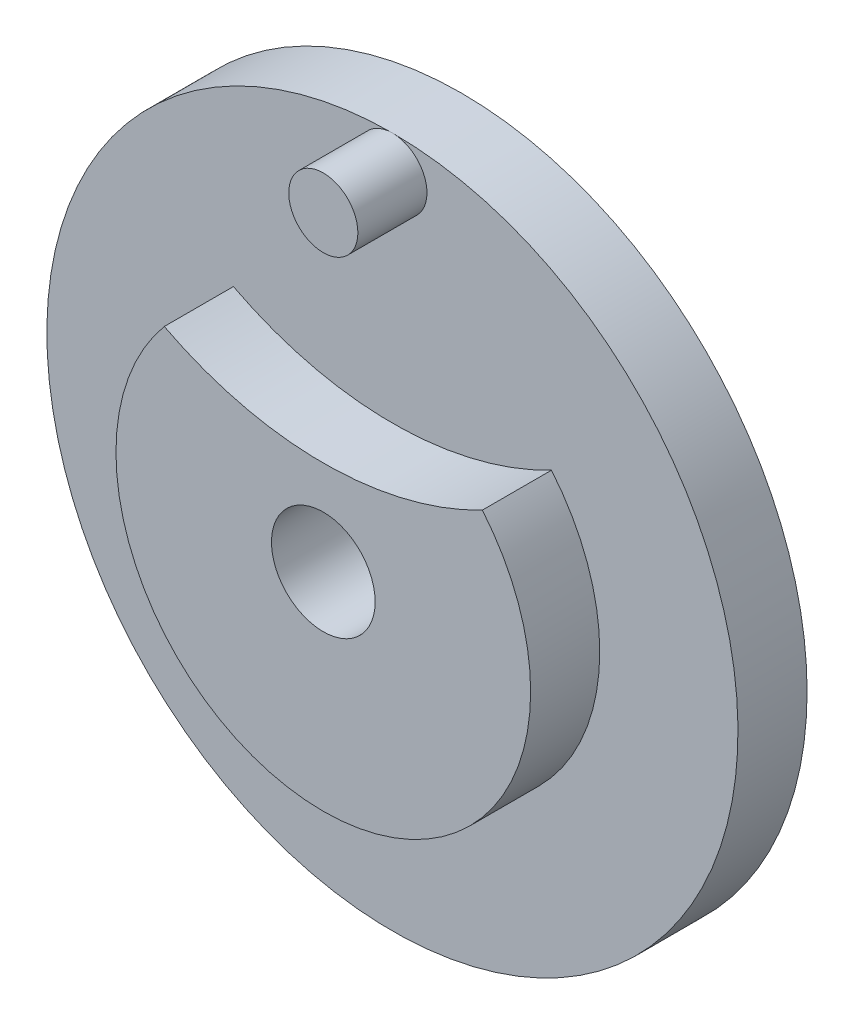
ISO-10303-21;
HEADER;
FILE_DESCRIPTION(('STEP AP214'),'2;1');
FILE_NAME('part.step','',(''),(''),'','','');
FILE_SCHEMA(('AUTOMOTIVE_DESIGN { 1 0 10303 214 1 1 1 1 }'));
ENDSEC;
DATA;
#1=APPLICATION_CONTEXT('core data for automotive mechanical design processes');
#2=APPLICATION_PROTOCOL_DEFINITION('international standard','automotive_design',2000,#1);
#3=PRODUCT_CONTEXT('',#1,'mechanical');
#4=PRODUCT('Part','Part','',(#3));
#5=PRODUCT_RELATED_PRODUCT_CATEGORY('part','',(#4));
#6=PRODUCT_DEFINITION_FORMATION('','',#4);
#7=PRODUCT_DEFINITION_CONTEXT('part definition',#1,'design');
#8=PRODUCT_DEFINITION('design','',#6,#7);
#9=PRODUCT_DEFINITION_SHAPE('','',#8);
#10=(LENGTH_UNIT() NAMED_UNIT(*) SI_UNIT(.MILLI.,.METRE.));
#11=(NAMED_UNIT(*) PLANE_ANGLE_UNIT() SI_UNIT($,.RADIAN.));
#12=(NAMED_UNIT(*) SI_UNIT($,.STERADIAN.) SOLID_ANGLE_UNIT());
#13=UNCERTAINTY_MEASURE_WITH_UNIT(LENGTH_MEASURE(1.E-05),#10,'distance_accuracy_value','');
#14=(GEOMETRIC_REPRESENTATION_CONTEXT(3) GLOBAL_UNCERTAINTY_ASSIGNED_CONTEXT((#13)) GLOBAL_UNIT_ASSIGNED_CONTEXT((#10,
#11,#12)) REPRESENTATION_CONTEXT('',''));
#15=CARTESIAN_POINT('',(0.,0.,0.));
#16=DIRECTION('',(0.,0.,1.));
#17=DIRECTION('',(1.,0.,0.));
#18=AXIS2_PLACEMENT_3D('',#15,#16,#17);
#19=CARTESIAN_POINT('',(0.,0.,2.5));
#20=DIRECTION('',(0.,0.,-1.));
#21=DIRECTION('',(-1.,0.,0.));
#22=AXIS2_PLACEMENT_3D('',#19,#20,#21);
#23=CYLINDRICAL_SURFACE('',#22,25.);
#24=CARTESIAN_POINT('',(0.,0.,2.5));
#25=DIRECTION('',(0.,0.,1.));
#26=DIRECTION('',(1.,0.,0.));
#27=AXIS2_PLACEMENT_3D('',#24,#25,#26);
#28=CIRCLE('',#27,25.);
#29=CARTESIAN_POINT('',(0.,25.,2.5));
#30=VERTEX_POINT('',#29);
#31=EDGE_CURVE('E82',#30,#30,#28,.T.);
#32=ORIENTED_EDGE('',*,*,#31,.F.);
#33=EDGE_LOOP('',(#32));
#34=FACE_BOUND('',#33,.T.);
#35=CARTESIAN_POINT('',(0.,0.,-2.5));
#36=DIRECTION('',(0.,0.,1.));
#37=DIRECTION('',(1.,0.,0.));
#38=AXIS2_PLACEMENT_3D('',#35,#36,#37);
#39=CIRCLE('',#38,25.);
#40=CARTESIAN_POINT('',(25.,0.,-2.5));
#41=VERTEX_POINT('',#40);
#42=EDGE_CURVE('E85',#41,#41,#39,.T.);
#43=ORIENTED_EDGE('',*,*,#42,.T.);
#44=EDGE_LOOP('',(#43));
#45=FACE_BOUND('',#44,.T.);
#46=ADVANCED_FACE('F33',(#34,#45),#23,.T.);
#47=CARTESIAN_POINT('',(0.,0.,2.5));
#48=DIRECTION('',(0.,0.,1.));
#49=DIRECTION('',(1.,0.,0.));
#50=AXIS2_PLACEMENT_3D('',#47,#48,#49);
#51=PLANE('',#50);
#52=CARTESIAN_POINT('',(0.,0.,2.5));
#53=DIRECTION('',(0.,0.,1.));
#54=DIRECTION('',(1.,0.,0.));
#55=AXIS2_PLACEMENT_3D('',#52,#53,#54);
#56=CIRCLE('',#55,15.);
#57=CARTESIAN_POINT('',(11.505168712167,9.6245048134735,2.5));
#58=VERTEX_POINT('',#57);
#59=CARTESIAN_POINT('',(-11.505168712167,9.6245048134735,2.5));
#60=VERTEX_POINT('',#59);
#61=EDGE_CURVE('E40',#58,#60,#56,.F.);
#62=ORIENTED_EDGE('',*,*,#61,.T.);
#63=CARTESIAN_POINT('',(0.,31.8197992,2.5));
#64=DIRECTION('',(0.,0.,1.));
#65=DIRECTION('',(1.,0.,0.));
#66=AXIS2_PLACEMENT_3D('',#63,#64,#65);
#67=CIRCLE('',#66,25.);
#68=EDGE_CURVE('E11',#60,#58,#67,.T.);
#69=ORIENTED_EDGE('',*,*,#68,.T.);
#70=EDGE_LOOP('',(#62,#69));
#71=FACE_BOUND('',#70,.T.);
#72=ORIENTED_EDGE('',*,*,#31,.T.);
#73=CARTESIAN_POINT('',(0.,22.5,2.5));
#74=DIRECTION('',(0.,0.,1.));
#75=DIRECTION('',(1.,0.,0.));
#76=AXIS2_PLACEMENT_3D('',#73,#74,#75);
#77=CIRCLE('',#76,2.5);
#78=EDGE_CURVE('E53',#30,#30,#77,.F.);
#79=ORIENTED_EDGE('',*,*,#78,.T.);
#80=EDGE_LOOP('',(#72,#79));
#81=FACE_BOUND('',#80,.T.);
#82=ADVANCED_FACE('F89',(#71,#81),#51,.T.);
#83=CARTESIAN_POINT('',(0.,0.,-2.5));
#84=DIRECTION('',(0.,0.,1.));
#85=DIRECTION('',(1.,0.,0.));
#86=AXIS2_PLACEMENT_3D('',#83,#84,#85);
#87=PLANE('',#86);
#88=CARTESIAN_POINT('',(0.,0.,-2.5));
#89=DIRECTION('',(0.,0.,1.));
#90=DIRECTION('',(1.,0.,0.));
#91=AXIS2_PLACEMENT_3D('',#88,#89,#90);
#92=CIRCLE('',#91,3.75);
#93=CARTESIAN_POINT('',(3.75,0.,-2.5));
#94=VERTEX_POINT('',#93);
#95=EDGE_CURVE('E72',#94,#94,#92,.T.);
#96=ORIENTED_EDGE('',*,*,#95,.T.);
#97=EDGE_LOOP('',(#96));
#98=FACE_BOUND('',#97,.T.);
#99=ORIENTED_EDGE('',*,*,#42,.F.);
#100=EDGE_LOOP('',(#99));
#101=FACE_BOUND('',#100,.T.);
#102=ADVANCED_FACE('F92',(#98,#101),#87,.F.);
#103=CARTESIAN_POINT('',(0.,22.5,7.5));
#104=DIRECTION('',(0.,0.,-1.));
#105=DIRECTION('',(-1.,0.,0.));
#106=AXIS2_PLACEMENT_3D('',#103,#104,#105);
#107=CYLINDRICAL_SURFACE('',#106,2.5);
#108=ORIENTED_EDGE('',*,*,#78,.F.);
#109=EDGE_LOOP('',(#108));
#110=FACE_BOUND('',#109,.T.);
#111=CARTESIAN_POINT('',(0.,22.5,7.5));
#112=DIRECTION('',(0.,0.,1.));
#113=DIRECTION('',(1.,0.,0.));
#114=AXIS2_PLACEMENT_3D('',#111,#112,#113);
#115=CIRCLE('',#114,2.5);
#116=CARTESIAN_POINT('',(2.5,22.5,7.5));
#117=VERTEX_POINT('',#116);
#118=EDGE_CURVE('E76',#117,#117,#115,.T.);
#119=ORIENTED_EDGE('',*,*,#118,.F.);
#120=EDGE_LOOP('',(#119));
#121=FACE_BOUND('',#120,.T.);
#122=ADVANCED_FACE('F101',(#110,#121),#107,.T.);
#123=CARTESIAN_POINT('',(0.,22.5,7.5));
#124=DIRECTION('',(0.,0.,1.));
#125=DIRECTION('',(1.,0.,0.));
#126=AXIS2_PLACEMENT_3D('',#123,#124,#125);
#127=PLANE('',#126);
#128=ORIENTED_EDGE('',*,*,#118,.T.);
#129=EDGE_LOOP('',(#128));
#130=FACE_BOUND('',#129,.T.);
#131=ADVANCED_FACE('F106',(#130),#127,.T.);
#132=CARTESIAN_POINT('',(0.,31.8197992,7.5));
#133=DIRECTION('',(0.,0.,-1.));
#134=DIRECTION('',(-1.,0.,0.));
#135=AXIS2_PLACEMENT_3D('',#132,#133,#134);
#136=CYLINDRICAL_SURFACE('',#135,25.);
#137=ORIENTED_EDGE('',*,*,#68,.F.);
#138=DIRECTION('',(0.,0.,-1.));
#139=VECTOR('',#138,1.);
#140=CARTESIAN_POINT('',(-11.505168712167,9.6245048134735,7.5));
#141=LINE('',#140,#139);
#142=CARTESIAN_POINT('',(-11.505168712167,9.6245048134735,7.5));
#143=VERTEX_POINT('',#142);
#144=EDGE_CURVE('E47',#143,#60,#141,.T.);
#145=ORIENTED_EDGE('',*,*,#144,.F.);
#146=CARTESIAN_POINT('',(0.,31.8197992,7.5));
#147=DIRECTION('',(0.,0.,-1.));
#148=DIRECTION('',(1.,0.,0.));
#149=AXIS2_PLACEMENT_3D('',#146,#147,#148);
#150=CIRCLE('',#149,25.);
#151=CARTESIAN_POINT('',(11.505168712167,9.6245048134735,7.5));
#152=VERTEX_POINT('',#151);
#153=EDGE_CURVE('E68',#152,#143,#150,.T.);
#154=ORIENTED_EDGE('',*,*,#153,.F.);
#155=DIRECTION('',(0.,0.,-1.));
#156=VECTOR('',#155,1.);
#157=CARTESIAN_POINT('',(11.505168712167,9.6245048134735,7.5));
#158=LINE('',#157,#156);
#159=EDGE_CURVE('E65',#152,#58,#158,.T.);
#160=ORIENTED_EDGE('',*,*,#159,.T.);
#161=EDGE_LOOP('',(#137,#145,#154,#160));
#162=FACE_BOUND('',#161,.T.);
#163=ADVANCED_FACE('F74',(#162),#136,.F.);
#164=CARTESIAN_POINT('',(0.,0.,7.5));
#165=DIRECTION('',(0.,0.,-1.));
#166=DIRECTION('',(-1.,0.,0.));
#167=AXIS2_PLACEMENT_3D('',#164,#165,#166);
#168=CYLINDRICAL_SURFACE('',#167,15.);
#169=ORIENTED_EDGE('',*,*,#61,.F.);
#170=ORIENTED_EDGE('',*,*,#159,.F.);
#171=CARTESIAN_POINT('',(0.,0.,7.5));
#172=DIRECTION('',(0.,0.,1.));
#173=DIRECTION('',(1.,0.,0.));
#174=AXIS2_PLACEMENT_3D('',#171,#172,#173);
#175=CIRCLE('',#174,15.);
#176=EDGE_CURVE('E61',#143,#152,#175,.T.);
#177=ORIENTED_EDGE('',*,*,#176,.F.);
#178=ORIENTED_EDGE('',*,*,#144,.T.);
#179=EDGE_LOOP('',(#169,#170,#177,#178));
#180=FACE_BOUND('',#179,.T.);
#181=ADVANCED_FACE('F63',(#180),#168,.T.);
#182=CARTESIAN_POINT('',(0.,15.9098996,7.5));
#183=DIRECTION('',(0.,0.,1.));
#184=DIRECTION('',(1.,0.,0.));
#185=AXIS2_PLACEMENT_3D('',#182,#183,#184);
#186=PLANE('',#185);
#187=CARTESIAN_POINT('',(0.,0.,7.5));
#188=DIRECTION('',(0.,0.,1.));
#189=DIRECTION('',(1.,0.,0.));
#190=AXIS2_PLACEMENT_3D('',#187,#188,#189);
#191=CIRCLE('',#190,3.75);
#192=CARTESIAN_POINT('',(3.75,0.,7.5));
#193=VERTEX_POINT('',#192);
#194=EDGE_CURVE('E129',#193,#193,#191,.T.);
#195=ORIENTED_EDGE('',*,*,#194,.F.);
#196=EDGE_LOOP('',(#195));
#197=FACE_BOUND('',#196,.T.);
#198=ORIENTED_EDGE('',*,*,#153,.T.);
#199=ORIENTED_EDGE('',*,*,#176,.T.);
#200=EDGE_LOOP('',(#198,#199));
#201=FACE_BOUND('',#200,.T.);
#202=ADVANCED_FACE('F70',(#197,#201),#186,.T.);
#203=CARTESIAN_POINT('',(0.,0.,-2.5));
#204=DIRECTION('',(0.,0.,1.));
#205=DIRECTION('',(1.,0.,0.));
#206=AXIS2_PLACEMENT_3D('',#203,#204,#205);
#207=CYLINDRICAL_SURFACE('',#206,3.75);
#208=ORIENTED_EDGE('',*,*,#95,.F.);
#209=EDGE_LOOP('',(#208));
#210=FACE_BOUND('',#209,.T.);
#211=ORIENTED_EDGE('',*,*,#194,.T.);
#212=EDGE_LOOP('',(#211));
#213=FACE_BOUND('',#212,.T.);
#214=ADVANCED_FACE('F119',(#210,#213),#207,.F.);
#215=CLOSED_SHELL('',(#46,#82,#102,#122,#131,#163,#181,#202,#214));
#216=MANIFOLD_SOLID_BREP('B2',#215);
#217=ADVANCED_BREP_SHAPE_REPRESENTATION('',(#18,#216),#14);
#218=SHAPE_DEFINITION_REPRESENTATION(#9,#217);
ENDSEC;
END-ISO-10303-21;
